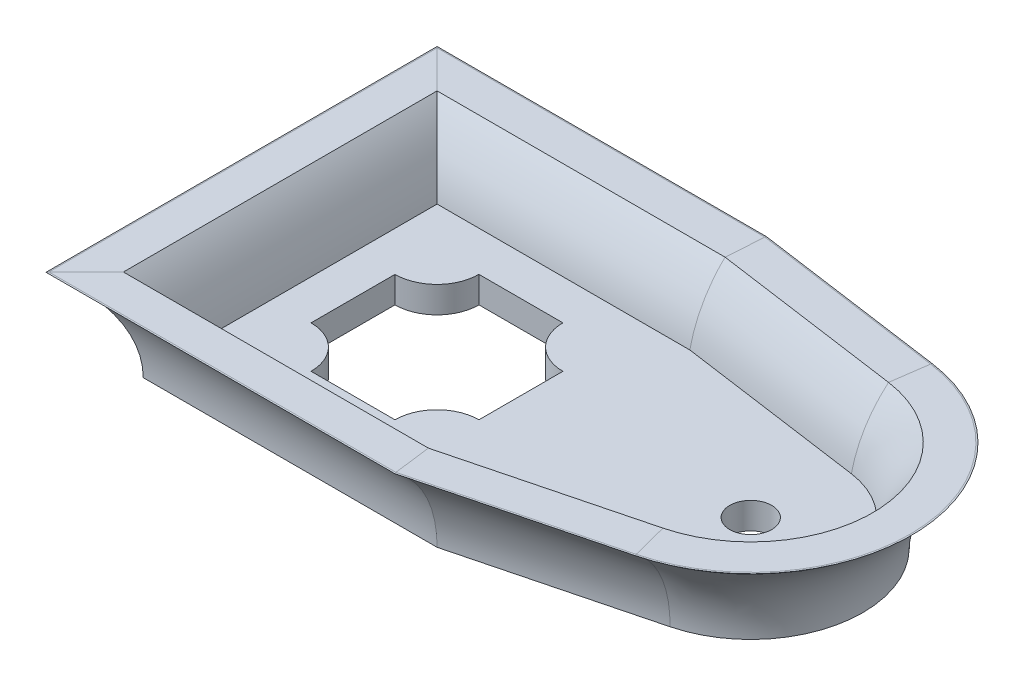
ISO-10303-21;
HEADER;
FILE_DESCRIPTION(('STEP AP214'),'2;1');
FILE_NAME('part.step','',(''),(''),'','','');
FILE_SCHEMA(('AUTOMOTIVE_DESIGN { 1 0 10303 214 1 1 1 1 }'));
ENDSEC;
DATA;
#1=APPLICATION_CONTEXT('core data for automotive mechanical design processes');
#2=APPLICATION_PROTOCOL_DEFINITION('international standard','automotive_design',2000,#1);
#3=PRODUCT_CONTEXT('',#1,'mechanical');
#4=PRODUCT('Part','Part','',(#3));
#5=PRODUCT_RELATED_PRODUCT_CATEGORY('part','',(#4));
#6=PRODUCT_DEFINITION_FORMATION('','',#4);
#7=PRODUCT_DEFINITION_CONTEXT('part definition',#1,'design');
#8=PRODUCT_DEFINITION('design','',#6,#7);
#9=PRODUCT_DEFINITION_SHAPE('','',#8);
#10=(LENGTH_UNIT() NAMED_UNIT(*) SI_UNIT(.MILLI.,.METRE.));
#11=(NAMED_UNIT(*) PLANE_ANGLE_UNIT() SI_UNIT($,.RADIAN.));
#12=(NAMED_UNIT(*) SI_UNIT($,.STERADIAN.) SOLID_ANGLE_UNIT());
#13=UNCERTAINTY_MEASURE_WITH_UNIT(LENGTH_MEASURE(1.E-05),#10,'distance_accuracy_value','');
#14=(GEOMETRIC_REPRESENTATION_CONTEXT(3) GLOBAL_UNCERTAINTY_ASSIGNED_CONTEXT((#13)) GLOBAL_UNIT_ASSIGNED_CONTEXT((#10,
#11,#12)) REPRESENTATION_CONTEXT('',''));
#15=CARTESIAN_POINT('',(0.,0.,0.));
#16=DIRECTION('',(0.,0.,1.));
#17=DIRECTION('',(1.,0.,0.));
#18=AXIS2_PLACEMENT_3D('',#15,#16,#17);
#19=CARTESIAN_POINT('',(-1.37423786545873,0.63,-3.74));
#20=DIRECTION('',(0.,1.,0.));
#21=DIRECTION('',(0.,0.,1.));
#22=AXIS2_PLACEMENT_3D('',#19,#20,#21);
#23=PLANE('',#22);
#24=CARTESIAN_POINT('',(10.75,0.63,-6.34172635228386));
#25=DIRECTION('',(0.,1.,0.));
#26=DIRECTION('',(0.,0.,1.));
#27=AXIS2_PLACEMENT_3D('',#24,#25,#26);
#28=CIRCLE('',#27,0.500000000000001);
#29=CARTESIAN_POINT('',(10.75,0.63,-5.84172635228385));
#30=VERTEX_POINT('',#29);
#31=EDGE_CURVE('E279',#30,#30,#28,.T.);
#32=ORIENTED_EDGE('',*,*,#31,.F.);
#33=EDGE_LOOP('',(#32));
#34=FACE_BOUND('',#33,.T.);
#35=DIRECTION('',(1.,0.,0.));
#36=VECTOR('',#35,1.);
#37=CARTESIAN_POINT('',(-1.37423786545873,0.63,-3.16796464626738));
#38=LINE('',#37,#36);
#39=CARTESIAN_POINT('',(0.547964646267378,0.63,-3.16796464626738));
#40=VERTEX_POINT('',#39);
#41=CARTESIAN_POINT('',(6.93064074206397,0.63,-3.16796464626738));
#42=VERTEX_POINT('',#41);
#43=EDGE_CURVE('E381',#40,#42,#38,.T.);
#44=ORIENTED_EDGE('',*,*,#43,.T.);
#45=DIRECTION('',(0.968462237024765,0.,-0.249160380993824));
#46=VECTOR('',#45,1.);
#47=CARTESIAN_POINT('',(6.61042123364328,0.63,-3.0855804172603));
#48=LINE('',#47,#46);
#49=CARTESIAN_POINT('',(11.2787271372184,0.63,-4.28661524656232));
#50=VERTEX_POINT('',#49);
#51=EDGE_CURVE('E395',#42,#50,#48,.T.);
#52=ORIENTED_EDGE('',*,*,#51,.T.);
#53=CARTESIAN_POINT('',(10.75,0.63,-6.34172635228386));
#54=DIRECTION('',(0.,1.,0.));
#55=DIRECTION('',(0.249160380993824,0.,0.968462237024765));
#56=AXIS2_PLACEMENT_3D('',#53,#54,#55);
#57=CIRCLE('',#56,2.12203535373262);
#58=CARTESIAN_POINT('',(11.0452096043804,0.63,-8.44312715459946));
#59=VERTEX_POINT('',#58);
#60=EDGE_CURVE('E436',#50,#59,#57,.T.);
#61=ORIENTED_EDGE('',*,*,#60,.T.);
#62=DIRECTION('',(-0.990276056720395,0.,-0.139116251697292));
#63=VECTOR('',#62,1.);
#64=CARTESIAN_POINT('',(11.0452096043804,0.63,-8.44312715459946));
#65=LINE('',#64,#63);
#66=CARTESIAN_POINT('',(6.56843047988342,0.63,-9.07203535373262));
#67=VERTEX_POINT('',#66);
#68=EDGE_CURVE('E501',#59,#67,#65,.T.);
#69=ORIENTED_EDGE('',*,*,#68,.T.);
#70=DIRECTION('',(-1.,0.,0.));
#71=VECTOR('',#70,1.);
#72=CARTESIAN_POINT('',(6.80673209507592,0.63,-9.07203535373262));
#73=LINE('',#72,#71);
#74=CARTESIAN_POINT('',(0.547964646267377,0.63,-9.07203535373262));
#75=VERTEX_POINT('',#74);
#76=EDGE_CURVE('E556',#67,#75,#73,.T.);
#77=ORIENTED_EDGE('',*,*,#76,.T.);
#78=DIRECTION('',(0.,0.,1.));
#79=VECTOR('',#78,1.);
#80=CARTESIAN_POINT('',(0.547964646267377,0.63,-10.9942378654587));
#81=LINE('',#80,#79);
#82=EDGE_CURVE('E538',#75,#40,#81,.T.);
#83=ORIENTED_EDGE('',*,*,#82,.T.);
#84=EDGE_LOOP('',(#44,#52,#61,#69,#77,#83));
#85=FACE_BOUND('',#84,.T.);
#86=DIRECTION('',(0.,0.,-1.));
#87=VECTOR('',#86,1.);
#88=CARTESIAN_POINT('',(5.49714014658227,0.63,-3.73999999999996));
#89=LINE('',#88,#87);
#90=CARTESIAN_POINT('',(5.49714014658228,0.63,-5.12000000000005));
#91=VERTEX_POINT('',#90);
#92=CARTESIAN_POINT('',(5.4971401465823,0.63,-7.12000000000004));
#93=VERTEX_POINT('',#92);
#94=EDGE_CURVE('E305',#91,#93,#89,.T.);
#95=ORIENTED_EDGE('',*,*,#94,.F.);
#96=CARTESIAN_POINT('',(5.49714014658228,0.63,-4.12000000000005));
#97=DIRECTION('',(0.,1.,0.));
#98=DIRECTION('',(0.,0.,1.));
#99=AXIS2_PLACEMENT_3D('',#96,#97,#98);
#100=CIRCLE('',#99,1.);
#101=CARTESIAN_POINT('',(4.49714014658229,0.63,-4.12000000000001));
#102=VERTEX_POINT('',#101);
#103=EDGE_CURVE('E233',#91,#102,#100,.T.);
#104=ORIENTED_EDGE('',*,*,#103,.T.);
#105=DIRECTION('',(1.,0.,0.));
#106=VECTOR('',#105,1.);
#107=CARTESIAN_POINT('',(-1.37423786545873,0.63,-4.12000000000007));
#108=LINE('',#107,#106);
#109=CARTESIAN_POINT('',(2.49714014658229,0.63,-4.12000000000003));
#110=VERTEX_POINT('',#109);
#111=EDGE_CURVE('E325',#110,#102,#108,.T.);
#112=ORIENTED_EDGE('',*,*,#111,.F.);
#113=CARTESIAN_POINT('',(1.49714014658227,0.63,-4.12));
#114=DIRECTION('',(0.,1.,0.));
#115=DIRECTION('',(0.,0.,1.));
#116=AXIS2_PLACEMENT_3D('',#113,#114,#115);
#117=CIRCLE('',#116,1.);
#118=CARTESIAN_POINT('',(1.49714014658227,0.63,-5.12));
#119=VERTEX_POINT('',#118);
#120=EDGE_CURVE('E322',#119,#110,#117,.F.);
#121=ORIENTED_EDGE('',*,*,#120,.F.);
#122=DIRECTION('',(0.,0.,1.));
#123=VECTOR('',#122,1.);
#124=CARTESIAN_POINT('',(1.49714014658227,0.63,-3.74));
#125=LINE('',#124,#123);
#126=CARTESIAN_POINT('',(1.49714014658227,0.63,-7.12));
#127=VERTEX_POINT('',#126);
#128=EDGE_CURVE('E319',#127,#119,#125,.T.);
#129=ORIENTED_EDGE('',*,*,#128,.F.);
#130=CARTESIAN_POINT('',(1.49714014658227,0.63,-8.12));
#131=DIRECTION('',(0.,1.,0.));
#132=DIRECTION('',(0.,0.,1.));
#133=AXIS2_PLACEMENT_3D('',#130,#131,#132);
#134=CIRCLE('',#133,1.);
#135=CARTESIAN_POINT('',(2.49714014658226,0.63,-8.12000000000004));
#136=VERTEX_POINT('',#135);
#137=EDGE_CURVE('E315',#127,#136,#134,.T.);
#138=ORIENTED_EDGE('',*,*,#137,.T.);
#139=DIRECTION('',(-1.,0.,0.));
#140=VECTOR('',#139,1.);
#141=CARTESIAN_POINT('',(-1.37423786545872,0.63,-8.12000000000006));
#142=LINE('',#141,#140);
#143=CARTESIAN_POINT('',(4.49714014658226,0.63,-8.12000000000004));
#144=VERTEX_POINT('',#143);
#145=EDGE_CURVE('E312',#144,#136,#142,.T.);
#146=ORIENTED_EDGE('',*,*,#145,.F.);
#147=CARTESIAN_POINT('',(5.49714014658226,0.63,-8.12000000000003));
#148=DIRECTION('',(0.,1.,0.));
#149=DIRECTION('',(0.,0.,1.));
#150=AXIS2_PLACEMENT_3D('',#147,#148,#149);
#151=CIRCLE('',#150,1.);
#152=EDGE_CURVE('E308',#144,#93,#151,.T.);
#153=ORIENTED_EDGE('',*,*,#152,.T.);
#154=EDGE_LOOP('',(#95,#104,#112,#121,#129,#138,#146,#153));
#155=FACE_BOUND('',#154,.T.);
#156=ADVANCED_FACE('F36',(#34,#85,#155),#23,.T.);
#157=CARTESIAN_POINT('',(-1.37423786545873,0.,-2.62));
#158=DIRECTION('',(0.,-1.,0.));
#159=DIRECTION('',(0.,0.,-1.));
#160=AXIS2_PLACEMENT_3D('',#157,#158,#159);
#161=PLANE('',#160);
#162=CARTESIAN_POINT('',(10.75,0.,-6.34172635228386));
#163=DIRECTION('',(0.,1.,0.));
#164=DIRECTION('',(0.,0.,1.));
#165=AXIS2_PLACEMENT_3D('',#162,#163,#164);
#166=CIRCLE('',#165,0.500000000000001);
#167=CARTESIAN_POINT('',(10.75,0.,-5.84172635228385));
#168=VERTEX_POINT('',#167);
#169=EDGE_CURVE('E251',#168,#168,#166,.T.);
#170=ORIENTED_EDGE('',*,*,#169,.T.);
#171=EDGE_LOOP('',(#170));
#172=FACE_BOUND('',#171,.T.);
#173=DIRECTION('',(1.,0.,0.));
#174=VECTOR('',#173,1.);
#175=CARTESIAN_POINT('',(-1.37423786545873,0.,-2.62));
#176=LINE('',#175,#174);
#177=CARTESIAN_POINT('',(0.,0.,-2.62));
#178=VERTEX_POINT('',#177);
#179=CARTESIAN_POINT('',(7.,0.,-2.62));
#180=VERTEX_POINT('',#179);
#181=EDGE_CURVE('E46',#178,#180,#176,.T.);
#182=ORIENTED_EDGE('',*,*,#181,.F.);
#183=DIRECTION('',(0.,0.,1.));
#184=VECTOR('',#183,1.);
#185=CARTESIAN_POINT('',(0.,0.,-10.9942378654587));
#186=LINE('',#185,#184);
#187=CARTESIAN_POINT('',(0.,0.,-9.62));
#188=VERTEX_POINT('',#187);
#189=EDGE_CURVE('E542',#188,#178,#186,.T.);
#190=ORIENTED_EDGE('',*,*,#189,.F.);
#191=DIRECTION('',(-1.,0.,0.));
#192=VECTOR('',#191,1.);
#193=CARTESIAN_POINT('',(6.80673209507592,0.,-9.62));
#194=LINE('',#193,#192);
#195=CARTESIAN_POINT('',(6.60673209507592,0.,-9.62));
#196=VERTEX_POINT('',#195);
#197=EDGE_CURVE('E559',#196,#188,#194,.T.);
#198=ORIENTED_EDGE('',*,*,#197,.F.);
#199=DIRECTION('',(-0.990276056720395,0.,-0.139116251697292));
#200=VECTOR('',#199,1.);
#201=CARTESIAN_POINT('',(11.1214403920318,0.,-8.98576342372731));
#202=LINE('',#201,#200);
#203=CARTESIAN_POINT('',(11.1214403920318,0.,-8.98576342372731));
#204=VERTEX_POINT('',#203);
#205=EDGE_CURVE('E497',#204,#196,#202,.T.);
#206=ORIENTED_EDGE('',*,*,#205,.F.);
#207=CARTESIAN_POINT('',(10.75,0.,-6.34172635228386));
#208=DIRECTION('',(0.,1.,0.));
#209=DIRECTION('',(0.249160380993824,0.,0.968462237024765));
#210=AXIS2_PLACEMENT_3D('',#207,#208,#209);
#211=CIRCLE('',#210,2.67);
#212=CARTESIAN_POINT('',(11.4152582172535,0.,-3.75593217942773));
#213=VERTEX_POINT('',#212);
#214=EDGE_CURVE('E413',#213,#204,#211,.T.);
#215=ORIENTED_EDGE('',*,*,#214,.F.);
#216=DIRECTION('',(0.968462237024765,0.,-0.249160380993824));
#217=VECTOR('',#216,1.);
#218=CARTESIAN_POINT('',(6.74695231367841,0.,-2.55489735012571));
#219=LINE('',#218,#217);
#220=EDGE_CURVE('E391',#180,#213,#219,.T.);
#221=ORIENTED_EDGE('',*,*,#220,.F.);
#222=EDGE_LOOP('',(#182,#190,#198,#206,#215,#221));
#223=FACE_BOUND('',#222,.T.);
#224=DIRECTION('',(1.,0.,0.));
#225=VECTOR('',#224,1.);
#226=CARTESIAN_POINT('',(0.,0.,-4.12000000000006));
#227=LINE('',#226,#225);
#228=CARTESIAN_POINT('',(2.49714014658229,0.,-4.12000000000003));
#229=VERTEX_POINT('',#228);
#230=CARTESIAN_POINT('',(4.49714014658229,0.,-4.12000000000001));
#231=VERTEX_POINT('',#230);
#232=EDGE_CURVE('E236',#229,#231,#227,.T.);
#233=ORIENTED_EDGE('',*,*,#232,.T.);
#234=CARTESIAN_POINT('',(5.49714014658228,0.,-4.12000000000005));
#235=DIRECTION('',(0.,1.,0.));
#236=DIRECTION('',(0.,0.,1.));
#237=AXIS2_PLACEMENT_3D('',#234,#235,#236);
#238=CIRCLE('',#237,1.);
#239=CARTESIAN_POINT('',(5.49714014658228,0.,-5.12000000000005));
#240=VERTEX_POINT('',#239);
#241=EDGE_CURVE('E230',#240,#231,#238,.T.);
#242=ORIENTED_EDGE('',*,*,#241,.F.);
#243=DIRECTION('',(0.,0.,-1.));
#244=VECTOR('',#243,1.);
#245=CARTESIAN_POINT('',(5.49714014658225,0.,0.));
#246=LINE('',#245,#244);
#247=CARTESIAN_POINT('',(5.4971401465823,0.,-7.12000000000004));
#248=VERTEX_POINT('',#247);
#249=EDGE_CURVE('E239',#240,#248,#246,.T.);
#250=ORIENTED_EDGE('',*,*,#249,.T.);
#251=CARTESIAN_POINT('',(5.49714014658226,0.,-8.12000000000003));
#252=DIRECTION('',(0.,1.,0.));
#253=DIRECTION('',(0.,0.,1.));
#254=AXIS2_PLACEMENT_3D('',#251,#252,#253);
#255=CIRCLE('',#254,1.);
#256=CARTESIAN_POINT('',(4.49714014658226,0.,-8.12000000000004));
#257=VERTEX_POINT('',#256);
#258=EDGE_CURVE('E244',#257,#248,#255,.T.);
#259=ORIENTED_EDGE('',*,*,#258,.F.);
#260=DIRECTION('',(-1.,0.,0.));
#261=VECTOR('',#260,1.);
#262=CARTESIAN_POINT('',(0.,0.,-8.12000000000005));
#263=LINE('',#262,#261);
#264=CARTESIAN_POINT('',(2.49714014658226,0.,-8.12000000000004));
#265=VERTEX_POINT('',#264);
#266=EDGE_CURVE('E260',#257,#265,#263,.T.);
#267=ORIENTED_EDGE('',*,*,#266,.T.);
#268=CARTESIAN_POINT('',(1.49714014658227,0.,-8.12));
#269=DIRECTION('',(0.,1.,0.));
#270=DIRECTION('',(0.,0.,1.));
#271=AXIS2_PLACEMENT_3D('',#268,#269,#270);
#272=CIRCLE('',#271,1.);
#273=CARTESIAN_POINT('',(1.49714014658227,0.,-7.12));
#274=VERTEX_POINT('',#273);
#275=EDGE_CURVE('E264',#274,#265,#272,.T.);
#276=ORIENTED_EDGE('',*,*,#275,.F.);
#277=DIRECTION('',(0.,0.,1.));
#278=VECTOR('',#277,1.);
#279=CARTESIAN_POINT('',(1.49714014658227,0.,0.));
#280=LINE('',#279,#278);
#281=CARTESIAN_POINT('',(1.49714014658227,0.,-5.12));
#282=VERTEX_POINT('',#281);
#283=EDGE_CURVE('E267',#274,#282,#280,.T.);
#284=ORIENTED_EDGE('',*,*,#283,.T.);
#285=CARTESIAN_POINT('',(1.49714014658227,0.,-4.12));
#286=DIRECTION('',(0.,1.,0.));
#287=DIRECTION('',(0.,0.,1.));
#288=AXIS2_PLACEMENT_3D('',#285,#286,#287);
#289=CIRCLE('',#288,1.);
#290=EDGE_CURVE('E271',#282,#229,#289,.F.);
#291=ORIENTED_EDGE('',*,*,#290,.T.);
#292=EDGE_LOOP('',(#233,#242,#250,#259,#267,#276,#284,#291));
#293=FACE_BOUND('',#292,.T.);
#294=ADVANCED_FACE('F247',(#172,#223,#293),#161,.T.);
#295=CARTESIAN_POINT('',(6.80673209507592,2.07,-10.7438202269269));
#296=DIRECTION('',(-1.,0.,0.));
#297=DIRECTION('',(0.,0.,1.));
#298=AXIS2_PLACEMENT_3D('',#295,#296,#297);
#299=CYLINDRICAL_SURFACE('',#298,0.11);
#300=DIRECTION('',(-1.,0.,0.));
#301=VECTOR('',#300,1.);
#302=CARTESIAN_POINT('',(6.80673209507592,2.17442400822605,-10.7783980595079));
#303=LINE('',#302,#301);
#304=CARTESIAN_POINT('',(6.68770176532242,2.17442400822605,-10.7783980595079));
#305=VERTEX_POINT('',#304);
#306=CARTESIAN_POINT('',(-1.15839805950794,2.17442400822605,-10.7783980595079));
#307=VERTEX_POINT('',#306);
#308=EDGE_CURVE('E40',#305,#307,#303,.T.);
#309=ORIENTED_EDGE('',*,*,#308,.T.);
#310=CARTESIAN_POINT('',(-1.12382022692685,2.07,-10.7438202269269));
#311=DIRECTION('',(-0.707106781186547,0.,0.707106781186547));
#312=DIRECTION('',(0.707106781186548,0.,0.707106781186548));
#313=AXIS2_PLACEMENT_3D('',#310,#311,#312);
#314=ELLIPSE('',#313,0.15556349186104,0.11);
#315=CARTESIAN_POINT('',(-1.12382022692685,2.18,-10.7438202269269));
#316=VERTEX_POINT('',#315);
#317=EDGE_CURVE('E525',#307,#316,#314,.F.);
#318=ORIENTED_EDGE('',*,*,#317,.T.);
#319=DIRECTION('',(-1.,0.,0.));
#320=VECTOR('',#319,1.);
#321=CARTESIAN_POINT('',(6.80673209507592,2.18,-10.7438202269269));
#322=LINE('',#321,#320);
#323=CARTESIAN_POINT('',(6.68528484509457,2.18,-10.7438202269269));
#324=VERTEX_POINT('',#323);
#325=EDGE_CURVE('E330',#324,#316,#322,.T.);
#326=ORIENTED_EDGE('',*,*,#325,.F.);
#327=CARTESIAN_POINT('',(6.68528484509457,2.07,-10.7438202269269));
#328=DIRECTION('',(-0.997566052128979,0.,-0.0697278397758193));
#329=DIRECTION('',(0.0697278397758193,0.,-0.997566052128979));
#330=AXIS2_PLACEMENT_3D('',#327,#328,#329);
#331=ELLIPSE('',#330,0.110268387507013,0.11);
#332=EDGE_CURVE('E474',#305,#324,#331,.F.);
#333=ORIENTED_EDGE('',*,*,#332,.F.);
#334=EDGE_LOOP('',(#309,#318,#326,#333));
#335=FACE_BOUND('',#334,.T.);
#336=ADVANCED_FACE('F38',(#335),#299,.T.);
#337=CARTESIAN_POINT('',(6.80673209507592,2.18,-9.856620047076));
#338=DIRECTION('',(0.,1.,0.));
#339=DIRECTION('',(0.,0.,1.));
#340=AXIS2_PLACEMENT_3D('',#337,#338,#339);
#341=PLANE('',#340);
#342=ORIENTED_EDGE('',*,*,#325,.T.);
#343=DIRECTION('',(0.707106781186548,0.,0.707106781186548));
#344=VECTOR('',#343,1.);
#345=CARTESIAN_POINT('',(-0.805428956267369,2.18,-10.4254289562674));
#346=LINE('',#345,#344);
#347=CARTESIAN_POINT('',(-0.236620047076003,2.18,-9.856620047076));
#348=VERTEX_POINT('',#347);
#349=EDGE_CURVE('E522',#316,#348,#346,.T.);
#350=ORIENTED_EDGE('',*,*,#349,.T.);
#351=DIRECTION('',(-1.,0.,0.));
#352=VECTOR('',#351,1.);
#353=CARTESIAN_POINT('',(6.80673209507592,2.18,-9.856620047076));
#354=LINE('',#353,#352);
#355=CARTESIAN_POINT('',(6.62327135550389,2.18,-9.856620047076));
#356=VERTEX_POINT('',#355);
#357=EDGE_CURVE('E552',#356,#348,#354,.T.);
#358=ORIENTED_EDGE('',*,*,#357,.F.);
#359=DIRECTION('',(-0.0697278397758193,0.,0.997566052128979));
#360=VECTOR('',#359,1.);
#361=CARTESIAN_POINT('',(6.60102501820034,2.18,-9.53835131898136));
#362=LINE('',#361,#360);
#363=EDGE_CURVE('E478',#324,#356,#362,.T.);
#364=ORIENTED_EDGE('',*,*,#363,.F.);
#365=EDGE_LOOP('',(#342,#350,#358,#364));
#366=FACE_BOUND('',#365,.T.);
#367=ADVANCED_FACE('F715',(#366),#341,.T.);
#368=CARTESIAN_POINT('',(6.80673209507592,0.,-12.24));
#369=DIRECTION('',(-1.,0.,0.));
#370=DIRECTION('',(0.,0.,1.));
#371=AXIS2_PLACEMENT_3D('',#368,#369,#370);
#372=CYLINDRICAL_SURFACE('',#371,3.23);
#373=ORIENTED_EDGE('',*,*,#357,.T.);
#374=CARTESIAN_POINT('',(-2.62,0.,-12.24));
#375=DIRECTION('',(-0.707106781186547,0.,0.707106781186547));
#376=DIRECTION('',(0.707106781186548,0.,0.707106781186548));
#377=AXIS2_PLACEMENT_3D('',#374,#375,#376);
#378=ELLIPSE('',#377,4.5679098064651,3.23);
#379=EDGE_CURVE('E519',#348,#75,#378,.F.);
#380=ORIENTED_EDGE('',*,*,#379,.T.);
#381=ORIENTED_EDGE('',*,*,#76,.F.);
#382=CARTESIAN_POINT('',(6.78986477067445,0.,-12.24));
#383=DIRECTION('',(-0.997566052128979,0.,-0.0697278397758193));
#384=DIRECTION('',(0.0697278397758193,0.,-0.997566052128979));
#385=AXIS2_PLACEMENT_3D('',#382,#383,#384);
#386=ELLIPSE('',#385,3.23788083316049,3.23);
#387=EDGE_CURVE('E482',#356,#67,#386,.F.);
#388=ORIENTED_EDGE('',*,*,#387,.F.);
#389=EDGE_LOOP('',(#373,#380,#381,#388));
#390=FACE_BOUND('',#389,.T.);
#391=ADVANCED_FACE('F628',(#390),#372,.T.);
#392=CARTESIAN_POINT('',(6.80673209507592,0.,-12.24));
#393=DIRECTION('',(-1.,0.,0.));
#394=DIRECTION('',(0.,0.,1.));
#395=AXIS2_PLACEMENT_3D('',#392,#393,#394);
#396=CYLINDRICAL_SURFACE('',#395,2.62);
#397=ORIENTED_EDGE('',*,*,#197,.T.);
#398=CARTESIAN_POINT('',(-2.62,0.,-12.24));
#399=DIRECTION('',(-0.707106781186547,0.,0.707106781186547));
#400=DIRECTION('',(0.707106781186548,0.,0.707106781186548));
#401=AXIS2_PLACEMENT_3D('',#398,#399,#400);
#402=ELLIPSE('',#401,3.70523953341751,2.62);
#403=EDGE_CURVE('E528',#188,#307,#402,.T.);
#404=ORIENTED_EDGE('',*,*,#403,.T.);
#405=ORIENTED_EDGE('',*,*,#308,.F.);
#406=CARTESIAN_POINT('',(6.78986477067445,0.,-12.24));
#407=DIRECTION('',(-0.997566052128979,0.,-0.0697278397758193));
#408=DIRECTION('',(0.0697278397758193,0.,-0.997566052128979));
#409=AXIS2_PLACEMENT_3D('',#406,#407,#408);
#410=ELLIPSE('',#409,2.62639250243978,2.62);
#411=EDGE_CURVE('E392',#196,#305,#410,.T.);
#412=ORIENTED_EDGE('',*,*,#411,.F.);
#413=EDGE_LOOP('',(#397,#404,#405,#412));
#414=FACE_BOUND('',#413,.T.);
#415=ADVANCED_FACE('F711',(#414),#396,.F.);
#416=CARTESIAN_POINT('',(-1.12382022692685,2.07,-10.9942378654587));
#417=DIRECTION('',(0.,0.,1.));
#418=DIRECTION('',(1.,0.,0.));
#419=AXIS2_PLACEMENT_3D('',#416,#417,#418);
#420=CYLINDRICAL_SURFACE('',#419,0.11);
#421=DIRECTION('',(0.,0.,1.));
#422=VECTOR('',#421,1.);
#423=CARTESIAN_POINT('',(-1.15839805950794,2.17442400822605,-10.9942378654587));
#424=LINE('',#423,#422);
#425=CARTESIAN_POINT('',(-1.15839805950794,2.17442400822605,-1.46160194049206));
#426=VERTEX_POINT('',#425);
#427=EDGE_CURVE('E493',#307,#426,#424,.T.);
#428=ORIENTED_EDGE('',*,*,#427,.T.);
#429=CARTESIAN_POINT('',(-1.12382022692685,2.07,-1.49617977307315));
#430=DIRECTION('',(0.707106781186547,0.,0.707106781186547));
#431=DIRECTION('',(0.707106781186548,0.,-0.707106781186548));
#432=AXIS2_PLACEMENT_3D('',#429,#430,#431);
#433=ELLIPSE('',#432,0.15556349186104,0.11);
#434=CARTESIAN_POINT('',(-1.12382022692685,2.18,-1.49617977307315));
#435=VERTEX_POINT('',#434);
#436=EDGE_CURVE('E360',#426,#435,#433,.F.);
#437=ORIENTED_EDGE('',*,*,#436,.T.);
#438=DIRECTION('',(0.,0.,1.));
#439=VECTOR('',#438,1.);
#440=CARTESIAN_POINT('',(-1.12382022692685,2.18,-10.9942378654587));
#441=LINE('',#440,#439);
#442=EDGE_CURVE('E515',#316,#435,#441,.T.);
#443=ORIENTED_EDGE('',*,*,#442,.F.);
#444=ORIENTED_EDGE('',*,*,#317,.F.);
#445=EDGE_LOOP('',(#428,#437,#443,#444));
#446=FACE_BOUND('',#445,.T.);
#447=ADVANCED_FACE('F576',(#446),#420,.T.);
#448=CARTESIAN_POINT('',(-0.236620047076004,2.18,-10.9942378654587));
#449=DIRECTION('',(0.,1.,0.));
#450=DIRECTION('',(0.,0.,1.));
#451=AXIS2_PLACEMENT_3D('',#448,#449,#450);
#452=PLANE('',#451);
#453=ORIENTED_EDGE('',*,*,#442,.T.);
#454=DIRECTION('',(0.707106781186548,0.,-0.707106781186548));
#455=VECTOR('',#454,1.);
#456=CARTESIAN_POINT('',(-0.805428956267367,2.18,-1.81457104373263));
#457=LINE('',#456,#455);
#458=CARTESIAN_POINT('',(-0.236620047076003,2.18,-2.383379952924));
#459=VERTEX_POINT('',#458);
#460=EDGE_CURVE('E355',#435,#459,#457,.T.);
#461=ORIENTED_EDGE('',*,*,#460,.T.);
#462=DIRECTION('',(0.,0.,1.));
#463=VECTOR('',#462,1.);
#464=CARTESIAN_POINT('',(-0.236620047076004,2.18,-10.9942378654587));
#465=LINE('',#464,#463);
#466=EDGE_CURVE('E534',#348,#459,#465,.T.);
#467=ORIENTED_EDGE('',*,*,#466,.F.);
#468=ORIENTED_EDGE('',*,*,#349,.F.);
#469=EDGE_LOOP('',(#453,#461,#467,#468));
#470=FACE_BOUND('',#469,.T.);
#471=ADVANCED_FACE('F638',(#470),#452,.T.);
#472=CARTESIAN_POINT('',(-2.62,0.,-10.9942378654587));
#473=DIRECTION('',(0.,0.,1.));
#474=DIRECTION('',(1.,0.,0.));
#475=AXIS2_PLACEMENT_3D('',#472,#473,#474);
#476=CYLINDRICAL_SURFACE('',#475,3.23);
#477=ORIENTED_EDGE('',*,*,#466,.T.);
#478=CARTESIAN_POINT('',(-2.62,0.,0.));
#479=DIRECTION('',(0.707106781186547,0.,0.707106781186547));
#480=DIRECTION('',(0.707106781186548,0.,-0.707106781186548));
#481=AXIS2_PLACEMENT_3D('',#478,#479,#480);
#482=ELLIPSE('',#481,4.5679098064651,3.23);
#483=EDGE_CURVE('E366',#459,#40,#482,.F.);
#484=ORIENTED_EDGE('',*,*,#483,.T.);
#485=ORIENTED_EDGE('',*,*,#82,.F.);
#486=ORIENTED_EDGE('',*,*,#379,.F.);
#487=EDGE_LOOP('',(#477,#484,#485,#486));
#488=FACE_BOUND('',#487,.T.);
#489=ADVANCED_FACE('F634',(#488),#476,.T.);
#490=CARTESIAN_POINT('',(-2.62,0.,-10.9942378654587));
#491=DIRECTION('',(0.,0.,1.));
#492=DIRECTION('',(1.,0.,0.));
#493=AXIS2_PLACEMENT_3D('',#490,#491,#492);
#494=CYLINDRICAL_SURFACE('',#493,2.62);
#495=ORIENTED_EDGE('',*,*,#189,.T.);
#496=CARTESIAN_POINT('',(-2.62,0.,0.));
#497=DIRECTION('',(0.707106781186547,0.,0.707106781186547));
#498=DIRECTION('',(0.707106781186548,0.,-0.707106781186548));
#499=AXIS2_PLACEMENT_3D('',#496,#497,#498);
#500=ELLIPSE('',#499,3.70523953341751,2.62);
#501=EDGE_CURVE('E356',#178,#426,#500,.T.);
#502=ORIENTED_EDGE('',*,*,#501,.T.);
#503=ORIENTED_EDGE('',*,*,#427,.F.);
#504=ORIENTED_EDGE('',*,*,#403,.F.);
#505=EDGE_LOOP('',(#495,#502,#503,#504));
#506=FACE_BOUND('',#505,.T.);
#507=ADVANCED_FACE('F579',(#506),#494,.F.);
#508=CARTESIAN_POINT('',(7.39975251188223,0.,-0.0175262891208266));
#509=DIRECTION('',(0.968462237024765,0.,-0.249160380993824));
#510=DIRECTION('',(-0.249160380993824,0.,-0.968462237024765));
#511=AXIS2_PLACEMENT_3D('',#508,#509,#510);
#512=CYLINDRICAL_SURFACE('',#511,2.62);
#513=CARTESIAN_POINT('',(7.33162952579192,0.,0.));
#514=DIRECTION('',(0.992084229545245,0.,-0.125574207095317));
#515=DIRECTION('',(0.125574207095317,0.,0.992084229545245));
#516=AXIS2_PLACEMENT_3D('',#513,#514,#515);
#517=ELLIPSE('',#516,2.64090479615926,2.62);
#518=CARTESIAN_POINT('',(7.14662557219576,2.17442400822605,-1.46160194049206));
#519=VERTEX_POINT('',#518);
#520=EDGE_CURVE('E331',#180,#519,#517,.T.);
#521=ORIENTED_EDGE('',*,*,#520,.F.);
#522=ORIENTED_EDGE('',*,*,#220,.T.);
#523=CARTESIAN_POINT('',(12.0680584154573,0.,-1.21856111842285));
#524=DIRECTION('',(-0.968462237024765,0.,0.249160380993824));
#525=DIRECTION('',(-0.249160380993824,0.,-0.968462237024765));
#526=AXIS2_PLACEMENT_3D('',#523,#524,#525);
#527=CIRCLE('',#526,2.62);
#528=CARTESIAN_POINT('',(11.703885119103,2.17442400822605,-2.63406740335153));
#529=VERTEX_POINT('',#528);
#530=EDGE_CURVE('E404',#529,#213,#527,.T.);
#531=ORIENTED_EDGE('',*,*,#530,.F.);
#532=DIRECTION('',(0.968462237024765,0.,-0.249160380993824));
#533=VECTOR('',#532,1.);
#534=CARTESIAN_POINT('',(7.03557921552791,2.17442400822605,-1.43303257404951));
#535=LINE('',#534,#533);
#536=EDGE_CURVE('E388',#519,#529,#535,.T.);
#537=ORIENTED_EDGE('',*,*,#536,.F.);
#538=EDGE_LOOP('',(#521,#522,#531,#537));
#539=FACE_BOUND('',#538,.T.);
#540=ADVANCED_FACE('F592',(#539),#512,.F.);
#541=CARTESIAN_POINT('',(7.39975251188223,0.,-0.0175262891208266));
#542=DIRECTION('',(0.968462237024765,0.,-0.249160380993824));
#543=DIRECTION('',(-0.249160380993824,0.,-0.968462237024765));
#544=AXIS2_PLACEMENT_3D('',#541,#542,#543);
#545=CYLINDRICAL_SURFACE('',#544,3.23);
#546=CARTESIAN_POINT('',(7.33162952579192,0.,0.));
#547=DIRECTION('',(0.992084229545245,0.,-0.125574207095317));
#548=DIRECTION('',(0.125574207095317,0.,0.992084229545245));
#549=AXIS2_PLACEMENT_3D('',#546,#547,#548);
#550=ELLIPSE('',#549,3.25577194335664,3.23);
#551=CARTESIAN_POINT('',(7.02995045572698,2.18,-2.383379952924));
#552=VERTEX_POINT('',#551);
#553=EDGE_CURVE('E344',#552,#42,#550,.F.);
#554=ORIENTED_EDGE('',*,*,#553,.F.);
#555=DIRECTION('',(0.968462237024765,0.,-0.249160380993824));
#556=VECTOR('',#555,1.);
#557=CARTESIAN_POINT('',(6.80590865475864,2.18,-2.32573977000958));
#558=LINE('',#557,#556);
#559=CARTESIAN_POINT('',(11.4742145583337,2.18,-3.5267745993116));
#560=VERTEX_POINT('',#559);
#561=EDGE_CURVE('E398',#552,#560,#558,.T.);
#562=ORIENTED_EDGE('',*,*,#561,.T.);
#563=CARTESIAN_POINT('',(12.0680584154573,0.,-1.21856111842285));
#564=DIRECTION('',(0.968462237024765,0.,-0.249160380993824));
#565=DIRECTION('',(-0.249160380993824,0.,-0.968462237024765));
#566=AXIS2_PLACEMENT_3D('',#563,#564,#565);
#567=CIRCLE('',#566,3.23);
#568=EDGE_CURVE('E432',#50,#560,#567,.T.);
#569=ORIENTED_EDGE('',*,*,#568,.F.);
#570=ORIENTED_EDGE('',*,*,#51,.F.);
#571=EDGE_LOOP('',(#554,#562,#569,#570));
#572=FACE_BOUND('',#571,.T.);
#573=ADVANCED_FACE('F657',(#572),#545,.T.);
#574=CARTESIAN_POINT('',(6.80590865475864,2.18,-2.32573977000958));
#575=DIRECTION('',(0.,1.,0.));
#576=DIRECTION('',(0.,0.,1.));
#577=AXIS2_PLACEMENT_3D('',#574,#575,#576);
#578=PLANE('',#577);
#579=DIRECTION('',(-0.125574207095317,0.,-0.992084229545245));
#580=VECTOR('',#579,1.);
#581=CARTESIAN_POINT('',(6.89742580609058,2.18,-3.43037533494924));
#582=LINE('',#581,#580);
#583=CARTESIAN_POINT('',(7.14224884310348,2.18,-1.49617977307315));
#584=VERTEX_POINT('',#583);
#585=EDGE_CURVE('E340',#584,#552,#582,.T.);
#586=ORIENTED_EDGE('',*,*,#585,.F.);
#587=DIRECTION('',(0.968462237024765,0.,-0.249160380993824));
#588=VECTOR('',#587,1.);
#589=CARTESIAN_POINT('',(7.02696378958807,2.18,-1.46651989914246));
#590=LINE('',#589,#588);
#591=CARTESIAN_POINT('',(11.6952696931632,2.18,-2.66755472844448));
#592=VERTEX_POINT('',#591);
#593=EDGE_CURVE('E401',#584,#592,#590,.T.);
#594=ORIENTED_EDGE('',*,*,#593,.T.);
#595=DIRECTION('',(0.249160380993824,0.,0.968462237024765));
#596=VECTOR('',#595,1.);
#597=CARTESIAN_POINT('',(11.4742145583337,2.18,-3.5267745993116));
#598=LINE('',#597,#596);
#599=EDGE_CURVE('E444',#560,#592,#598,.T.);
#600=ORIENTED_EDGE('',*,*,#599,.F.);
#601=ORIENTED_EDGE('',*,*,#561,.F.);
#602=EDGE_LOOP('',(#586,#594,#600,#601));
#603=FACE_BOUND('',#602,.T.);
#604=ADVANCED_FACE('F650',(#603),#578,.T.);
#605=CARTESIAN_POINT('',(7.02696378958807,2.07,-1.46651989914246));
#606=DIRECTION('',(0.968462237024765,0.,-0.249160380993824));
#607=DIRECTION('',(-0.249160380993824,0.,-0.968462237024765));
#608=AXIS2_PLACEMENT_3D('',#605,#606,#607);
#609=CYLINDRICAL_SURFACE('',#608,0.11);
#610=CARTESIAN_POINT('',(7.14224884310348,2.07,-1.49617977307315));
#611=DIRECTION('',(0.992084229545245,0.,-0.125574207095317));
#612=DIRECTION('',(0.125574207095317,0.,0.992084229545245));
#613=AXIS2_PLACEMENT_3D('',#610,#611,#612);
#614=ELLIPSE('',#613,0.110877682281495,0.11);
#615=EDGE_CURVE('E336',#519,#584,#614,.F.);
#616=ORIENTED_EDGE('',*,*,#615,.F.);
#617=ORIENTED_EDGE('',*,*,#536,.T.);
#618=CARTESIAN_POINT('',(11.6952696931632,2.07,-2.66755472844448));
#619=DIRECTION('',(0.968462237024765,0.,-0.249160380993824));
#620=DIRECTION('',(-0.249160380993824,0.,-0.968462237024765));
#621=AXIS2_PLACEMENT_3D('',#618,#619,#620);
#622=CIRCLE('',#621,0.11);
#623=EDGE_CURVE('E422',#592,#529,#622,.T.);
#624=ORIENTED_EDGE('',*,*,#623,.F.);
#625=ORIENTED_EDGE('',*,*,#593,.F.);
#626=EDGE_LOOP('',(#616,#617,#624,#625));
#627=FACE_BOUND('',#626,.T.);
#628=ADVANCED_FACE('F648',(#627),#609,.T.);
#629=CARTESIAN_POINT('',(10.75,0.,-6.34172635228386));
#630=DIRECTION('',(0.,1.,0.));
#631=DIRECTION('',(0.,0.,1.));
#632=AXIS2_PLACEMENT_3D('',#629,#630,#631);
#633=TOROIDAL_SURFACE('',#632,5.29,2.62);
#634=ORIENTED_EDGE('',*,*,#214,.T.);
#635=CARTESIAN_POINT('',(11.4859249714787,0.,-11.5802866923347));
#636=DIRECTION('',(0.990276056720395,0.,0.139116251697292));
#637=DIRECTION('',(-0.139116251697292,0.,0.990276056720396));
#638=AXIS2_PLACEMENT_3D('',#635,#636,#637);
#639=CIRCLE('',#638,2.62);
#640=CARTESIAN_POINT('',(11.2825923880439,2.17442400822605,-10.1328972862094));
#641=VERTEX_POINT('',#640);
#642=EDGE_CURVE('E409',#641,#204,#639,.T.);
#643=ORIENTED_EDGE('',*,*,#642,.F.);
#644=CARTESIAN_POINT('',(10.75,2.17442400822605,-6.34172635228386));
#645=DIRECTION('',(0.,1.,0.));
#646=DIRECTION('',(0.249160380993824,0.,0.968462237024765));
#647=AXIS2_PLACEMENT_3D('',#644,#645,#646);
#648=CIRCLE('',#647,3.82839805950794);
#649=EDGE_CURVE('E414',#529,#641,#648,.T.);
#650=ORIENTED_EDGE('',*,*,#649,.F.);
#651=ORIENTED_EDGE('',*,*,#530,.T.);
#652=EDGE_LOOP('',(#634,#643,#650,#651));
#653=FACE_BOUND('',#652,.T.);
#654=ADVANCED_FACE('F597',(#653),#633,.F.);
#655=CARTESIAN_POINT('',(10.75,0.,-6.34172635228386));
#656=DIRECTION('',(0.,1.,0.));
#657=DIRECTION('',(0.,0.,1.));
#658=AXIS2_PLACEMENT_3D('',#655,#656,#657);
#659=TOROIDAL_SURFACE('',#658,5.29,3.23);
#660=CARTESIAN_POINT('',(10.75,2.18,-6.34172635228386));
#661=DIRECTION('',(0.,1.,0.));
#662=DIRECTION('',(0.249160380993824,0.,0.968462237024765));
#663=AXIS2_PLACEMENT_3D('',#660,#661,#662);
#664=CIRCLE('',#663,2.906620047076);
#665=CARTESIAN_POINT('',(11.1543580860574,2.18,-9.22008259088673));
#666=VERTEX_POINT('',#665);
#667=EDGE_CURVE('E448',#560,#666,#664,.T.);
#668=ORIENTED_EDGE('',*,*,#667,.T.);
#669=CARTESIAN_POINT('',(11.4859249714787,0.,-11.5802866923347));
#670=DIRECTION('',(-0.990276056720395,0.,-0.139116251697292));
#671=DIRECTION('',(-0.139116251697292,0.,0.990276056720396));
#672=AXIS2_PLACEMENT_3D('',#669,#670,#671);
#673=CIRCLE('',#672,3.23);
#674=EDGE_CURVE('E440',#59,#666,#673,.T.);
#675=ORIENTED_EDGE('',*,*,#674,.F.);
#676=ORIENTED_EDGE('',*,*,#60,.F.);
#677=ORIENTED_EDGE('',*,*,#568,.T.);
#678=EDGE_LOOP('',(#668,#675,#676,#677));
#679=FACE_BOUND('',#678,.T.);
#680=ADVANCED_FACE('F620',(#679),#659,.T.);
#681=CARTESIAN_POINT('',(11.4742145583337,2.18,-3.5267745993116));
#682=DIRECTION('',(0.,1.,0.));
#683=DIRECTION('',(0.,0.,1.));
#684=AXIS2_PLACEMENT_3D('',#681,#682,#683);
#685=PLANE('',#684);
#686=CARTESIAN_POINT('',(10.75,2.18,-6.34172635228386));
#687=DIRECTION('',(0.,1.,0.));
#688=DIRECTION('',(0.249160380993824,0.,0.968462237024765));
#689=AXIS2_PLACEMENT_3D('',#686,#687,#688);
#690=CIRCLE('',#689,3.79382022692685);
#691=CARTESIAN_POINT('',(11.2777820495834,2.18,-10.0986556865111));
#692=VERTEX_POINT('',#691);
#693=EDGE_CURVE('E459',#592,#692,#690,.T.);
#694=ORIENTED_EDGE('',*,*,#693,.T.);
#695=DIRECTION('',(0.139116251697292,0.,-0.990276056720396));
#696=VECTOR('',#695,1.);
#697=CARTESIAN_POINT('',(11.1543580860574,2.18,-9.22008259088673));
#698=LINE('',#697,#696);
#699=EDGE_CURVE('E452',#666,#692,#698,.T.);
#700=ORIENTED_EDGE('',*,*,#699,.F.);
#701=ORIENTED_EDGE('',*,*,#667,.F.);
#702=ORIENTED_EDGE('',*,*,#599,.T.);
#703=EDGE_LOOP('',(#694,#700,#701,#702));
#704=FACE_BOUND('',#703,.T.);
#705=ADVANCED_FACE('F610',(#704),#685,.T.);
#706=CARTESIAN_POINT('',(10.75,2.07,-6.34172635228386));
#707=DIRECTION('',(0.,1.,0.));
#708=DIRECTION('',(0.,0.,1.));
#709=AXIS2_PLACEMENT_3D('',#706,#707,#708);
#710=TOROIDAL_SURFACE('',#709,3.79382022692685,0.11);
#711=CARTESIAN_POINT('',(11.2777820495834,2.07,-10.0986556865111));
#712=DIRECTION('',(-0.990276056720395,0.,-0.139116251697292));
#713=DIRECTION('',(-0.139116251697292,0.,0.990276056720396));
#714=AXIS2_PLACEMENT_3D('',#711,#712,#713);
#715=CIRCLE('',#714,0.11);
#716=EDGE_CURVE('E463',#692,#641,#715,.T.);
#717=ORIENTED_EDGE('',*,*,#716,.F.);
#718=ORIENTED_EDGE('',*,*,#693,.F.);
#719=ORIENTED_EDGE('',*,*,#623,.T.);
#720=ORIENTED_EDGE('',*,*,#649,.T.);
#721=EDGE_LOOP('',(#717,#718,#719,#720));
#722=FACE_BOUND('',#721,.T.);
#723=ADVANCED_FACE('F606',(#722),#710,.T.);
#724=CARTESIAN_POINT('',(11.4859249714787,0.,-11.5802866923347));
#725=DIRECTION('',(-0.990276056720395,0.,-0.139116251697292));
#726=DIRECTION('',(-0.139116251697292,0.,0.990276056720395));
#727=AXIS2_PLACEMENT_3D('',#724,#725,#726);
#728=CYLINDRICAL_SURFACE('',#727,2.62);
#729=ORIENTED_EDGE('',*,*,#205,.T.);
#730=ORIENTED_EDGE('',*,*,#411,.T.);
#731=DIRECTION('',(-0.990276056720395,0.,-0.139116251697292));
#732=VECTOR('',#731,1.);
#733=CARTESIAN_POINT('',(11.2825923880439,2.17442400822605,-10.1328972862094));
#734=LINE('',#733,#732);
#735=EDGE_CURVE('E470',#641,#305,#734,.T.);
#736=ORIENTED_EDGE('',*,*,#735,.F.);
#737=ORIENTED_EDGE('',*,*,#642,.T.);
#738=EDGE_LOOP('',(#729,#730,#736,#737));
#739=FACE_BOUND('',#738,.T.);
#740=ADVANCED_FACE('F600',(#739),#728,.F.);
#741=CARTESIAN_POINT('',(11.4859249714787,0.,-11.5802866923347));
#742=DIRECTION('',(-0.990276056720395,0.,-0.139116251697292));
#743=DIRECTION('',(-0.139116251697292,0.,0.990276056720395));
#744=AXIS2_PLACEMENT_3D('',#741,#742,#743);
#745=CYLINDRICAL_SURFACE('',#744,3.23);
#746=DIRECTION('',(-0.990276056720395,0.,-0.139116251697292));
#747=VECTOR('',#746,1.);
#748=CARTESIAN_POINT('',(11.1543580860574,2.18,-9.22008259088673));
#749=LINE('',#748,#747);
#750=EDGE_CURVE('E505',#666,#356,#749,.T.);
#751=ORIENTED_EDGE('',*,*,#750,.T.);
#752=ORIENTED_EDGE('',*,*,#387,.T.);
#753=ORIENTED_EDGE('',*,*,#68,.F.);
#754=ORIENTED_EDGE('',*,*,#674,.T.);
#755=EDGE_LOOP('',(#751,#752,#753,#754));
#756=FACE_BOUND('',#755,.T.);
#757=ADVANCED_FACE('F616',(#756),#745,.T.);
#758=CARTESIAN_POINT('',(11.1543580860574,2.18,-9.22008259088673));
#759=DIRECTION('',(0.,1.,0.));
#760=DIRECTION('',(0.,0.,1.));
#761=AXIS2_PLACEMENT_3D('',#758,#759,#760);
#762=PLANE('',#761);
#763=DIRECTION('',(-0.990276056720395,0.,-0.139116251697292));
#764=VECTOR('',#763,1.);
#765=CARTESIAN_POINT('',(11.2777820495834,2.18,-10.0986556865111));
#766=LINE('',#765,#764);
#767=EDGE_CURVE('E373',#692,#324,#766,.T.);
#768=ORIENTED_EDGE('',*,*,#767,.T.);
#769=ORIENTED_EDGE('',*,*,#363,.T.);
#770=ORIENTED_EDGE('',*,*,#750,.F.);
#771=ORIENTED_EDGE('',*,*,#699,.T.);
#772=EDGE_LOOP('',(#768,#769,#770,#771));
#773=FACE_BOUND('',#772,.T.);
#774=ADVANCED_FACE('F614',(#773),#762,.T.);
#775=CARTESIAN_POINT('',(11.2777820495834,2.07,-10.0986556865111));
#776=DIRECTION('',(-0.990276056720395,0.,-0.139116251697292));
#777=DIRECTION('',(-0.139116251697292,0.,0.990276056720395));
#778=AXIS2_PLACEMENT_3D('',#775,#776,#777);
#779=CYLINDRICAL_SURFACE('',#778,0.11);
#780=ORIENTED_EDGE('',*,*,#735,.T.);
#781=ORIENTED_EDGE('',*,*,#332,.T.);
#782=ORIENTED_EDGE('',*,*,#767,.F.);
#783=ORIENTED_EDGE('',*,*,#716,.T.);
#784=EDGE_LOOP('',(#780,#781,#782,#783));
#785=FACE_BOUND('',#784,.T.);
#786=ADVANCED_FACE('F603',(#785),#779,.T.);
#787=CARTESIAN_POINT('',(-1.37423786545873,2.07,-1.49617977307315));
#788=DIRECTION('',(1.,0.,0.));
#789=DIRECTION('',(0.,0.,-1.));
#790=AXIS2_PLACEMENT_3D('',#787,#788,#789);
#791=CYLINDRICAL_SURFACE('',#790,0.11);
#792=ORIENTED_EDGE('',*,*,#436,.F.);
#793=DIRECTION('',(1.,0.,0.));
#794=VECTOR('',#793,1.);
#795=CARTESIAN_POINT('',(-1.37423786545873,2.17442400822605,-1.46160194049206));
#796=LINE('',#795,#794);
#797=EDGE_CURVE('E11',#426,#519,#796,.T.);
#798=ORIENTED_EDGE('',*,*,#797,.T.);
#799=ORIENTED_EDGE('',*,*,#615,.T.);
#800=DIRECTION('',(1.,0.,0.));
#801=VECTOR('',#800,1.);
#802=CARTESIAN_POINT('',(-1.37423786545873,2.18,-1.49617977307315));
#803=LINE('',#802,#801);
#804=EDGE_CURVE('E335',#435,#584,#803,.T.);
#805=ORIENTED_EDGE('',*,*,#804,.F.);
#806=EDGE_LOOP('',(#792,#798,#799,#805));
#807=FACE_BOUND('',#806,.T.);
#808=ADVANCED_FACE('F645',(#807),#791,.T.);
#809=CARTESIAN_POINT('',(-1.37423786545873,2.18,-2.383379952924));
#810=DIRECTION('',(0.,1.,0.));
#811=DIRECTION('',(0.,0.,1.));
#812=AXIS2_PLACEMENT_3D('',#809,#810,#811);
#813=PLANE('',#812);
#814=ORIENTED_EDGE('',*,*,#460,.F.);
#815=ORIENTED_EDGE('',*,*,#804,.T.);
#816=ORIENTED_EDGE('',*,*,#585,.T.);
#817=DIRECTION('',(1.,0.,0.));
#818=VECTOR('',#817,1.);
#819=CARTESIAN_POINT('',(-1.37423786545873,2.18,-2.383379952924));
#820=LINE('',#819,#818);
#821=EDGE_CURVE('E377',#459,#552,#820,.T.);
#822=ORIENTED_EDGE('',*,*,#821,.F.);
#823=EDGE_LOOP('',(#814,#815,#816,#822));
#824=FACE_BOUND('',#823,.T.);
#825=ADVANCED_FACE('F643',(#824),#813,.T.);
#826=CARTESIAN_POINT('',(-1.37423786545873,0.,0.));
#827=DIRECTION('',(1.,0.,0.));
#828=DIRECTION('',(0.,0.,-1.));
#829=AXIS2_PLACEMENT_3D('',#826,#827,#828);
#830=CYLINDRICAL_SURFACE('',#829,3.23);
#831=ORIENTED_EDGE('',*,*,#483,.F.);
#832=ORIENTED_EDGE('',*,*,#821,.T.);
#833=ORIENTED_EDGE('',*,*,#553,.T.);
#834=ORIENTED_EDGE('',*,*,#43,.F.);
#835=EDGE_LOOP('',(#831,#832,#833,#834));
#836=FACE_BOUND('',#835,.T.);
#837=ADVANCED_FACE('F653',(#836),#830,.T.);
#838=CARTESIAN_POINT('',(-1.37423786545873,0.,0.));
#839=DIRECTION('',(1.,0.,0.));
#840=DIRECTION('',(0.,0.,-1.));
#841=AXIS2_PLACEMENT_3D('',#838,#839,#840);
#842=CYLINDRICAL_SURFACE('',#841,2.62);
#843=ORIENTED_EDGE('',*,*,#501,.F.);
#844=ORIENTED_EDGE('',*,*,#181,.T.);
#845=ORIENTED_EDGE('',*,*,#520,.T.);
#846=ORIENTED_EDGE('',*,*,#797,.F.);
#847=EDGE_LOOP('',(#843,#844,#845,#846));
#848=FACE_BOUND('',#847,.T.);
#849=ADVANCED_FACE('F585',(#848),#842,.F.);
#850=CARTESIAN_POINT('',(10.75,0.,-6.34172635228386));
#851=DIRECTION('',(0.,1.,0.));
#852=DIRECTION('',(0.,0.,1.));
#853=AXIS2_PLACEMENT_3D('',#850,#851,#852);
#854=CYLINDRICAL_SURFACE('',#853,0.500000000000001);
#855=ORIENTED_EDGE('',*,*,#31,.T.);
#856=EDGE_LOOP('',(#855));
#857=FACE_BOUND('',#856,.T.);
#858=ORIENTED_EDGE('',*,*,#169,.F.);
#859=EDGE_LOOP('',(#858));
#860=FACE_BOUND('',#859,.T.);
#861=ADVANCED_FACE('F680',(#857,#860),#854,.F.);
#862=CARTESIAN_POINT('',(5.49714014658228,0.,-4.12000000000005));
#863=DIRECTION('',(0.,1.,0.));
#864=DIRECTION('',(0.,0.,1.));
#865=AXIS2_PLACEMENT_3D('',#862,#863,#864);
#866=CYLINDRICAL_SURFACE('',#865,1.);
#867=DIRECTION('',(0.,1.,0.));
#868=VECTOR('',#867,1.);
#869=CARTESIAN_POINT('',(5.49714014658228,0.,-5.12000000000005));
#870=LINE('',#869,#868);
#871=EDGE_CURVE('E54',#240,#91,#870,.T.);
#872=ORIENTED_EDGE('',*,*,#871,.F.);
#873=ORIENTED_EDGE('',*,*,#241,.T.);
#874=DIRECTION('',(0.,1.,0.));
#875=VECTOR('',#874,1.);
#876=CARTESIAN_POINT('',(4.49714014658229,0.,-4.12000000000001));
#877=LINE('',#876,#875);
#878=EDGE_CURVE('E276',#231,#102,#877,.T.);
#879=ORIENTED_EDGE('',*,*,#878,.T.);
#880=ORIENTED_EDGE('',*,*,#103,.F.);
#881=EDGE_LOOP('',(#872,#873,#879,#880));
#882=FACE_BOUND('',#881,.T.);
#883=ADVANCED_FACE('F227',(#882),#866,.T.);
#884=CARTESIAN_POINT('',(0.,0.,-4.12000000000006));
#885=DIRECTION('',(0.,0.,1.));
#886=DIRECTION('',(1.,0.,0.));
#887=AXIS2_PLACEMENT_3D('',#884,#885,#886);
#888=PLANE('',#887);
#889=ORIENTED_EDGE('',*,*,#111,.T.);
#890=ORIENTED_EDGE('',*,*,#878,.F.);
#891=ORIENTED_EDGE('',*,*,#232,.F.);
#892=DIRECTION('',(0.,1.,0.));
#893=VECTOR('',#892,1.);
#894=CARTESIAN_POINT('',(2.49714014658229,0.,-4.12000000000003));
#895=LINE('',#894,#893);
#896=EDGE_CURVE('E280',#229,#110,#895,.T.);
#897=ORIENTED_EDGE('',*,*,#896,.T.);
#898=EDGE_LOOP('',(#889,#890,#891,#897));
#899=FACE_BOUND('',#898,.T.);
#900=ADVANCED_FACE('F729',(#899),#888,.F.);
#901=CARTESIAN_POINT('',(1.49714014658227,0.,-4.12));
#902=DIRECTION('',(0.,1.,0.));
#903=DIRECTION('',(0.,0.,1.));
#904=AXIS2_PLACEMENT_3D('',#901,#902,#903);
#905=CYLINDRICAL_SURFACE('',#904,1.);
#906=ORIENTED_EDGE('',*,*,#120,.T.);
#907=ORIENTED_EDGE('',*,*,#896,.F.);
#908=ORIENTED_EDGE('',*,*,#290,.F.);
#909=DIRECTION('',(0.,1.,0.));
#910=VECTOR('',#909,1.);
#911=CARTESIAN_POINT('',(1.49714014658227,0.,-5.12));
#912=LINE('',#911,#910);
#913=EDGE_CURVE('E284',#282,#119,#912,.T.);
#914=ORIENTED_EDGE('',*,*,#913,.T.);
#915=EDGE_LOOP('',(#906,#907,#908,#914));
#916=FACE_BOUND('',#915,.T.);
#917=ADVANCED_FACE('F766',(#916),#905,.T.);
#918=CARTESIAN_POINT('',(1.49714014658227,0.,0.));
#919=DIRECTION('',(-1.,0.,0.));
#920=DIRECTION('',(0.,0.,1.));
#921=AXIS2_PLACEMENT_3D('',#918,#919,#920);
#922=PLANE('',#921);
#923=ORIENTED_EDGE('',*,*,#128,.T.);
#924=ORIENTED_EDGE('',*,*,#913,.F.);
#925=ORIENTED_EDGE('',*,*,#283,.F.);
#926=DIRECTION('',(0.,1.,0.));
#927=VECTOR('',#926,1.);
#928=CARTESIAN_POINT('',(1.49714014658227,0.,-7.12));
#929=LINE('',#928,#927);
#930=EDGE_CURVE('E288',#274,#127,#929,.T.);
#931=ORIENTED_EDGE('',*,*,#930,.T.);
#932=EDGE_LOOP('',(#923,#924,#925,#931));
#933=FACE_BOUND('',#932,.T.);
#934=ADVANCED_FACE('F776',(#933),#922,.F.);
#935=CARTESIAN_POINT('',(1.49714014658227,0.,-8.12));
#936=DIRECTION('',(0.,1.,0.));
#937=DIRECTION('',(0.,0.,1.));
#938=AXIS2_PLACEMENT_3D('',#935,#936,#937);
#939=CYLINDRICAL_SURFACE('',#938,1.);
#940=ORIENTED_EDGE('',*,*,#930,.F.);
#941=ORIENTED_EDGE('',*,*,#275,.T.);
#942=DIRECTION('',(0.,1.,0.));
#943=VECTOR('',#942,1.);
#944=CARTESIAN_POINT('',(2.49714014658226,0.,-8.12000000000004));
#945=LINE('',#944,#943);
#946=EDGE_CURVE('E292',#265,#136,#945,.T.);
#947=ORIENTED_EDGE('',*,*,#946,.T.);
#948=ORIENTED_EDGE('',*,*,#137,.F.);
#949=EDGE_LOOP('',(#940,#941,#947,#948));
#950=FACE_BOUND('',#949,.T.);
#951=ADVANCED_FACE('F786',(#950),#939,.T.);
#952=CARTESIAN_POINT('',(0.,0.,-8.12000000000005));
#953=DIRECTION('',(0.,0.,-1.));
#954=DIRECTION('',(-1.,0.,0.));
#955=AXIS2_PLACEMENT_3D('',#952,#953,#954);
#956=PLANE('',#955);
#957=ORIENTED_EDGE('',*,*,#145,.T.);
#958=ORIENTED_EDGE('',*,*,#946,.F.);
#959=ORIENTED_EDGE('',*,*,#266,.F.);
#960=DIRECTION('',(0.,1.,0.));
#961=VECTOR('',#960,1.);
#962=CARTESIAN_POINT('',(4.49714014658226,0.,-8.12000000000004));
#963=LINE('',#962,#961);
#964=EDGE_CURVE('E296',#257,#144,#963,.T.);
#965=ORIENTED_EDGE('',*,*,#964,.T.);
#966=EDGE_LOOP('',(#957,#958,#959,#965));
#967=FACE_BOUND('',#966,.T.);
#968=ADVANCED_FACE('F796',(#967),#956,.F.);
#969=CARTESIAN_POINT('',(5.49714014658226,0.,-8.12000000000003));
#970=DIRECTION('',(0.,1.,0.));
#971=DIRECTION('',(0.,0.,1.));
#972=AXIS2_PLACEMENT_3D('',#969,#970,#971);
#973=CYLINDRICAL_SURFACE('',#972,1.);
#974=ORIENTED_EDGE('',*,*,#964,.F.);
#975=ORIENTED_EDGE('',*,*,#258,.T.);
#976=DIRECTION('',(0.,1.,0.));
#977=VECTOR('',#976,1.);
#978=CARTESIAN_POINT('',(5.4971401465823,0.,-7.12000000000004));
#979=LINE('',#978,#977);
#980=EDGE_CURVE('E59',#248,#93,#979,.T.);
#981=ORIENTED_EDGE('',*,*,#980,.T.);
#982=ORIENTED_EDGE('',*,*,#152,.F.);
#983=EDGE_LOOP('',(#974,#975,#981,#982));
#984=FACE_BOUND('',#983,.T.);
#985=ADVANCED_FACE('F806',(#984),#973,.T.);
#986=CARTESIAN_POINT('',(5.49714014658225,0.,0.));
#987=DIRECTION('',(1.,0.,0.));
#988=DIRECTION('',(0.,0.,-1.));
#989=AXIS2_PLACEMENT_3D('',#986,#987,#988);
#990=PLANE('',#989);
#991=ORIENTED_EDGE('',*,*,#94,.T.);
#992=ORIENTED_EDGE('',*,*,#980,.F.);
#993=ORIENTED_EDGE('',*,*,#249,.F.);
#994=ORIENTED_EDGE('',*,*,#871,.T.);
#995=EDGE_LOOP('',(#991,#992,#993,#994));
#996=FACE_BOUND('',#995,.T.);
#997=ADVANCED_FACE('F240',(#996),#990,.F.);
#998=CLOSED_SHELL('',(#156,#294,#336,#367,#391,#415,#447,#471,#489,#507,#540,#573,#604,#628,
#654,#680,#705,#723,#740,#757,#774,#786,#808,#825,#837,#849,#861,#883,#900,#917,#934,#951,#968,
#985,#997));
#999=MANIFOLD_SOLID_BREP('B2',#998);
#1000=ADVANCED_BREP_SHAPE_REPRESENTATION('',(#18,#999),#14);
#1001=SHAPE_DEFINITION_REPRESENTATION(#9,#1000);
ENDSEC;
END-ISO-10303-21;
